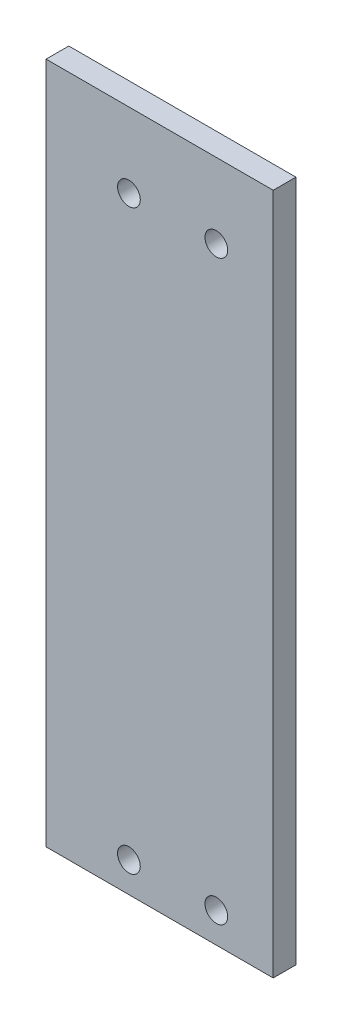
ISO-10303-21;
HEADER;
FILE_DESCRIPTION(('STEP AP214'),'2;1');
FILE_NAME('part.step','',(''),(''),'','','');
FILE_SCHEMA(('AUTOMOTIVE_DESIGN { 1 0 10303 214 1 1 1 1 }'));
ENDSEC;
DATA;
#1=APPLICATION_CONTEXT('core data for automotive mechanical design processes');
#2=APPLICATION_PROTOCOL_DEFINITION('international standard','automotive_design',2000,#1);
#3=PRODUCT_CONTEXT('',#1,'mechanical');
#4=PRODUCT('Part','Part','',(#3));
#5=PRODUCT_RELATED_PRODUCT_CATEGORY('part','',(#4));
#6=PRODUCT_DEFINITION_FORMATION('','',#4);
#7=PRODUCT_DEFINITION_CONTEXT('part definition',#1,'design');
#8=PRODUCT_DEFINITION('design','',#6,#7);
#9=PRODUCT_DEFINITION_SHAPE('','',#8);
#10=(LENGTH_UNIT() NAMED_UNIT(*) SI_UNIT(.MILLI.,.METRE.));
#11=(NAMED_UNIT(*) PLANE_ANGLE_UNIT() SI_UNIT($,.RADIAN.));
#12=(NAMED_UNIT(*) SI_UNIT($,.STERADIAN.) SOLID_ANGLE_UNIT());
#13=UNCERTAINTY_MEASURE_WITH_UNIT(LENGTH_MEASURE(1.E-05),#10,'distance_accuracy_value','');
#14=(GEOMETRIC_REPRESENTATION_CONTEXT(3) GLOBAL_UNCERTAINTY_ASSIGNED_CONTEXT((#13)) GLOBAL_UNIT_ASSIGNED_CONTEXT((#10,
#11,#12)) REPRESENTATION_CONTEXT('',''));
#15=CARTESIAN_POINT('',(0.,0.,0.));
#16=DIRECTION('',(0.,0.,1.));
#17=DIRECTION('',(1.,0.,0.));
#18=AXIS2_PLACEMENT_3D('',#15,#16,#17);
#19=CARTESIAN_POINT('',(0.,0.,5.));
#20=DIRECTION('',(0.,0.,-1.));
#21=DIRECTION('',(-1.,0.,0.));
#22=AXIS2_PLACEMENT_3D('',#19,#20,#21);
#23=PLANE('',#22);
#24=DIRECTION('',(-1.,0.,0.));
#25=VECTOR('',#24,1.);
#26=CARTESIAN_POINT('',(-14.267057546844,150.188218987102,5.));
#27=LINE('',#26,#25);
#28=CARTESIAN_POINT('',(35.7329424531562,150.188218987102,5.));
#29=VERTEX_POINT('',#28);
#30=CARTESIAN_POINT('',(-14.267057546844,150.188218987102,5.));
#31=VERTEX_POINT('',#30);
#32=EDGE_CURVE('E91',#29,#31,#27,.T.);
#33=ORIENTED_EDGE('',*,*,#32,.T.);
#34=DIRECTION('',(0.,-1.,0.));
#35=VECTOR('',#34,1.);
#36=CARTESIAN_POINT('',(-14.267057546844,150.188218987102,5.));
#37=LINE('',#36,#35);
#38=CARTESIAN_POINT('',(-14.267057546844,1.66533453693773E-13,5.));
#39=VERTEX_POINT('',#38);
#40=EDGE_CURVE('E86',#31,#39,#37,.T.);
#41=ORIENTED_EDGE('',*,*,#40,.T.);
#42=DIRECTION('',(1.,0.,0.));
#43=VECTOR('',#42,1.);
#44=CARTESIAN_POINT('',(-14.267057546844,1.66533453693773E-13,5.));
#45=LINE('',#44,#43);
#46=CARTESIAN_POINT('',(35.7329424531562,1.66533453693773E-13,5.));
#47=VERTEX_POINT('',#46);
#48=EDGE_CURVE('E89',#39,#47,#45,.T.);
#49=ORIENTED_EDGE('',*,*,#48,.T.);
#50=DIRECTION('',(0.,1.,0.));
#51=VECTOR('',#50,1.);
#52=CARTESIAN_POINT('',(35.7329424531562,150.188218987102,5.));
#53=LINE('',#52,#51);
#54=EDGE_CURVE('E56',#47,#29,#53,.T.);
#55=ORIENTED_EDGE('',*,*,#54,.T.);
#56=EDGE_LOOP('',(#33,#41,#49,#55));
#57=FACE_BOUND('',#56,.T.);
#58=CARTESIAN_POINT('',(23.2110009360298,6.64734363436636,5.));
#59=DIRECTION('',(0.,0.,1.));
#60=DIRECTION('',(1.,0.,0.));
#61=AXIS2_PLACEMENT_3D('',#58,#59,#60);
#62=CIRCLE('',#61,2.49999999999999);
#63=CARTESIAN_POINT('',(25.7110009360298,6.64734363436636,5.));
#64=VERTEX_POINT('',#63);
#65=EDGE_CURVE('E106',#64,#64,#62,.T.);
#66=ORIENTED_EDGE('',*,*,#65,.F.);
#67=EDGE_LOOP('',(#66));
#68=FACE_BOUND('',#67,.T.);
#69=CARTESIAN_POINT('',(3.96840034913737,6.64734363436636,5.));
#70=DIRECTION('',(0.,0.,1.));
#71=DIRECTION('',(1.,0.,0.));
#72=AXIS2_PLACEMENT_3D('',#69,#70,#71);
#73=CIRCLE('',#72,2.5);
#74=CARTESIAN_POINT('',(6.46840034913737,6.64734363436636,5.));
#75=VERTEX_POINT('',#74);
#76=EDGE_CURVE('E121',#75,#75,#73,.T.);
#77=ORIENTED_EDGE('',*,*,#76,.F.);
#78=EDGE_LOOP('',(#77));
#79=FACE_BOUND('',#78,.T.);
#80=CARTESIAN_POINT('',(3.96840034913735,133.729094339838,5.));
#81=DIRECTION('',(0.,0.,1.));
#82=DIRECTION('',(-1.,0.,0.));
#83=AXIS2_PLACEMENT_3D('',#80,#81,#82);
#84=CIRCLE('',#83,2.5);
#85=CARTESIAN_POINT('',(1.46840034913735,133.729094339838,5.));
#86=VERTEX_POINT('',#85);
#87=EDGE_CURVE('E127',#86,#86,#84,.T.);
#88=ORIENTED_EDGE('',*,*,#87,.F.);
#89=EDGE_LOOP('',(#88));
#90=FACE_BOUND('',#89,.T.);
#91=CARTESIAN_POINT('',(23.2110009360298,133.729094339838,5.));
#92=DIRECTION('',(0.,0.,1.));
#93=DIRECTION('',(-1.,0.,0.));
#94=AXIS2_PLACEMENT_3D('',#91,#92,#93);
#95=CIRCLE('',#94,2.5);
#96=CARTESIAN_POINT('',(20.7110009360298,133.729094339838,5.));
#97=VERTEX_POINT('',#96);
#98=EDGE_CURVE('E133',#97,#97,#95,.T.);
#99=ORIENTED_EDGE('',*,*,#98,.F.);
#100=EDGE_LOOP('',(#99));
#101=FACE_BOUND('',#100,.T.);
#102=ADVANCED_FACE('F39',(#57,#68,#79,#90,#101),#23,.F.);
#103=CARTESIAN_POINT('',(0.,0.,0.));
#104=DIRECTION('',(0.,0.,-1.));
#105=DIRECTION('',(-1.,0.,0.));
#106=AXIS2_PLACEMENT_3D('',#103,#104,#105);
#107=PLANE('',#106);
#108=CARTESIAN_POINT('',(3.96840034913735,133.729094339838,0.));
#109=DIRECTION('',(0.,0.,1.));
#110=DIRECTION('',(-1.,0.,0.));
#111=AXIS2_PLACEMENT_3D('',#108,#109,#110);
#112=CIRCLE('',#111,2.5);
#113=CARTESIAN_POINT('',(1.46840034913735,133.729094339838,0.));
#114=VERTEX_POINT('',#113);
#115=EDGE_CURVE('E130',#114,#114,#112,.T.);
#116=ORIENTED_EDGE('',*,*,#115,.T.);
#117=EDGE_LOOP('',(#116));
#118=FACE_BOUND('',#117,.T.);
#119=CARTESIAN_POINT('',(23.2110009360298,6.64734363436636,0.));
#120=DIRECTION('',(0.,0.,1.));
#121=DIRECTION('',(1.,0.,0.));
#122=AXIS2_PLACEMENT_3D('',#119,#120,#121);
#123=CIRCLE('',#122,2.49999999999999);
#124=CARTESIAN_POINT('',(25.7110009360298,6.64734363436636,0.));
#125=VERTEX_POINT('',#124);
#126=EDGE_CURVE('E118',#125,#125,#123,.T.);
#127=ORIENTED_EDGE('',*,*,#126,.T.);
#128=EDGE_LOOP('',(#127));
#129=FACE_BOUND('',#128,.T.);
#130=DIRECTION('',(-1.,0.,0.));
#131=VECTOR('',#130,1.);
#132=CARTESIAN_POINT('',(-14.267057546844,150.188218987102,0.));
#133=LINE('',#132,#131);
#134=CARTESIAN_POINT('',(35.7329424531562,150.188218987102,0.));
#135=VERTEX_POINT('',#134);
#136=CARTESIAN_POINT('',(-14.267057546844,150.188218987102,0.));
#137=VERTEX_POINT('',#136);
#138=EDGE_CURVE('E103',#135,#137,#133,.T.);
#139=ORIENTED_EDGE('',*,*,#138,.F.);
#140=DIRECTION('',(0.,1.,0.));
#141=VECTOR('',#140,1.);
#142=CARTESIAN_POINT('',(35.7329424531562,150.188218987102,0.));
#143=LINE('',#142,#141);
#144=CARTESIAN_POINT('',(35.7329424531562,1.66533453693773E-13,0.));
#145=VERTEX_POINT('',#144);
#146=EDGE_CURVE('E79',#145,#135,#143,.T.);
#147=ORIENTED_EDGE('',*,*,#146,.F.);
#148=DIRECTION('',(1.,0.,0.));
#149=VECTOR('',#148,1.);
#150=CARTESIAN_POINT('',(-14.267057546844,1.66533453693773E-13,0.));
#151=LINE('',#150,#149);
#152=CARTESIAN_POINT('',(-14.267057546844,1.66533453693773E-13,0.));
#153=VERTEX_POINT('',#152);
#154=EDGE_CURVE('E73',#153,#145,#151,.T.);
#155=ORIENTED_EDGE('',*,*,#154,.F.);
#156=DIRECTION('',(0.,-1.,0.));
#157=VECTOR('',#156,1.);
#158=CARTESIAN_POINT('',(-14.267057546844,150.188218987102,0.));
#159=LINE('',#158,#157);
#160=EDGE_CURVE('E95',#137,#153,#159,.T.);
#161=ORIENTED_EDGE('',*,*,#160,.F.);
#162=EDGE_LOOP('',(#139,#147,#155,#161));
#163=FACE_BOUND('',#162,.T.);
#164=CARTESIAN_POINT('',(3.96840034913737,6.64734363436636,0.));
#165=DIRECTION('',(0.,0.,1.));
#166=DIRECTION('',(1.,0.,0.));
#167=AXIS2_PLACEMENT_3D('',#164,#165,#166);
#168=CIRCLE('',#167,2.5);
#169=CARTESIAN_POINT('',(6.46840034913737,6.64734363436636,0.));
#170=VERTEX_POINT('',#169);
#171=EDGE_CURVE('E124',#170,#170,#168,.T.);
#172=ORIENTED_EDGE('',*,*,#171,.T.);
#173=EDGE_LOOP('',(#172));
#174=FACE_BOUND('',#173,.T.);
#175=CARTESIAN_POINT('',(23.2110009360298,133.729094339838,0.));
#176=DIRECTION('',(0.,0.,1.));
#177=DIRECTION('',(-1.,0.,0.));
#178=AXIS2_PLACEMENT_3D('',#175,#176,#177);
#179=CIRCLE('',#178,2.5);
#180=CARTESIAN_POINT('',(20.7110009360298,133.729094339838,0.));
#181=VERTEX_POINT('',#180);
#182=EDGE_CURVE('E136',#181,#181,#179,.T.);
#183=ORIENTED_EDGE('',*,*,#182,.T.);
#184=EDGE_LOOP('',(#183));
#185=FACE_BOUND('',#184,.T.);
#186=ADVANCED_FACE('F114',(#118,#129,#163,#174,#185),#107,.T.);
#187=CARTESIAN_POINT('',(-14.267057546844,150.188218987102,5.));
#188=DIRECTION('',(0.,-1.,0.));
#189=DIRECTION('',(1.,0.,0.));
#190=AXIS2_PLACEMENT_3D('',#187,#188,#189);
#191=PLANE('',#190);
#192=ORIENTED_EDGE('',*,*,#138,.T.);
#193=DIRECTION('',(0.,0.,-1.));
#194=VECTOR('',#193,1.);
#195=CARTESIAN_POINT('',(-14.267057546844,150.188218987102,5.));
#196=LINE('',#195,#194);
#197=EDGE_CURVE('E11',#31,#137,#196,.T.);
#198=ORIENTED_EDGE('',*,*,#197,.F.);
#199=ORIENTED_EDGE('',*,*,#32,.F.);
#200=DIRECTION('',(0.,0.,-1.));
#201=VECTOR('',#200,1.);
#202=CARTESIAN_POINT('',(35.7329424531562,150.188218987102,5.));
#203=LINE('',#202,#201);
#204=EDGE_CURVE('E99',#29,#135,#203,.T.);
#205=ORIENTED_EDGE('',*,*,#204,.T.);
#206=EDGE_LOOP('',(#192,#198,#199,#205));
#207=FACE_BOUND('',#206,.T.);
#208=ADVANCED_FACE('F41',(#207),#191,.F.);
#209=CARTESIAN_POINT('',(-14.267057546844,150.188218987102,5.));
#210=DIRECTION('',(1.,0.,0.));
#211=DIRECTION('',(0.,0.,-1.));
#212=AXIS2_PLACEMENT_3D('',#209,#210,#211);
#213=PLANE('',#212);
#214=ORIENTED_EDGE('',*,*,#160,.T.);
#215=DIRECTION('',(0.,0.,-1.));
#216=VECTOR('',#215,1.);
#217=CARTESIAN_POINT('',(-14.267057546844,1.66533453693773E-13,5.));
#218=LINE('',#217,#216);
#219=EDGE_CURVE('E48',#39,#153,#218,.T.);
#220=ORIENTED_EDGE('',*,*,#219,.F.);
#221=ORIENTED_EDGE('',*,*,#40,.F.);
#222=ORIENTED_EDGE('',*,*,#197,.T.);
#223=EDGE_LOOP('',(#214,#220,#221,#222));
#224=FACE_BOUND('',#223,.T.);
#225=ADVANCED_FACE('F94',(#224),#213,.F.);
#226=CARTESIAN_POINT('',(-14.267057546844,1.66533453693773E-13,5.));
#227=DIRECTION('',(0.,1.,0.));
#228=DIRECTION('',(0.,0.,1.));
#229=AXIS2_PLACEMENT_3D('',#226,#227,#228);
#230=PLANE('',#229);
#231=ORIENTED_EDGE('',*,*,#154,.T.);
#232=DIRECTION('',(0.,0.,-1.));
#233=VECTOR('',#232,1.);
#234=CARTESIAN_POINT('',(35.7329424531562,1.66533453693773E-13,5.));
#235=LINE('',#234,#233);
#236=EDGE_CURVE('E96',#47,#145,#235,.T.);
#237=ORIENTED_EDGE('',*,*,#236,.F.);
#238=ORIENTED_EDGE('',*,*,#48,.F.);
#239=ORIENTED_EDGE('',*,*,#219,.T.);
#240=EDGE_LOOP('',(#231,#237,#238,#239));
#241=FACE_BOUND('',#240,.T.);
#242=ADVANCED_FACE('F97',(#241),#230,.F.);
#243=CARTESIAN_POINT('',(35.7329424531562,150.188218987102,5.));
#244=DIRECTION('',(-1.,0.,0.));
#245=DIRECTION('',(0.,0.,1.));
#246=AXIS2_PLACEMENT_3D('',#243,#244,#245);
#247=PLANE('',#246);
#248=ORIENTED_EDGE('',*,*,#146,.T.);
#249=ORIENTED_EDGE('',*,*,#204,.F.);
#250=ORIENTED_EDGE('',*,*,#54,.F.);
#251=ORIENTED_EDGE('',*,*,#236,.T.);
#252=EDGE_LOOP('',(#248,#249,#250,#251));
#253=FACE_BOUND('',#252,.T.);
#254=ADVANCED_FACE('F111',(#253),#247,.F.);
#255=CARTESIAN_POINT('',(23.2110009360298,6.64734363436636,5.));
#256=DIRECTION('',(0.,0.,-1.));
#257=DIRECTION('',(-1.,0.,0.));
#258=AXIS2_PLACEMENT_3D('',#255,#256,#257);
#259=CYLINDRICAL_SURFACE('',#258,2.49999999999999);
#260=ORIENTED_EDGE('',*,*,#65,.T.);
#261=EDGE_LOOP('',(#260));
#262=FACE_BOUND('',#261,.T.);
#263=ORIENTED_EDGE('',*,*,#126,.F.);
#264=EDGE_LOOP('',(#263));
#265=FACE_BOUND('',#264,.T.);
#266=ADVANCED_FACE('F153',(#262,#265),#259,.F.);
#267=CARTESIAN_POINT('',(3.96840034913737,6.64734363436636,5.));
#268=DIRECTION('',(0.,0.,-1.));
#269=DIRECTION('',(-1.,0.,0.));
#270=AXIS2_PLACEMENT_3D('',#267,#268,#269);
#271=CYLINDRICAL_SURFACE('',#270,2.5);
#272=ORIENTED_EDGE('',*,*,#76,.T.);
#273=EDGE_LOOP('',(#272));
#274=FACE_BOUND('',#273,.T.);
#275=ORIENTED_EDGE('',*,*,#171,.F.);
#276=EDGE_LOOP('',(#275));
#277=FACE_BOUND('',#276,.T.);
#278=ADVANCED_FACE('F198',(#274,#277),#271,.F.);
#279=CARTESIAN_POINT('',(3.96840034913735,133.729094339838,5.));
#280=DIRECTION('',(0.,0.,-1.));
#281=DIRECTION('',(-1.,0.,0.));
#282=AXIS2_PLACEMENT_3D('',#279,#280,#281);
#283=CYLINDRICAL_SURFACE('',#282,2.5);
#284=ORIENTED_EDGE('',*,*,#87,.T.);
#285=EDGE_LOOP('',(#284));
#286=FACE_BOUND('',#285,.T.);
#287=ORIENTED_EDGE('',*,*,#115,.F.);
#288=EDGE_LOOP('',(#287));
#289=FACE_BOUND('',#288,.T.);
#290=ADVANCED_FACE('F206',(#286,#289),#283,.F.);
#291=CARTESIAN_POINT('',(23.2110009360298,133.729094339838,5.));
#292=DIRECTION('',(0.,0.,-1.));
#293=DIRECTION('',(-1.,0.,0.));
#294=AXIS2_PLACEMENT_3D('',#291,#292,#293);
#295=CYLINDRICAL_SURFACE('',#294,2.5);
#296=ORIENTED_EDGE('',*,*,#98,.T.);
#297=EDGE_LOOP('',(#296));
#298=FACE_BOUND('',#297,.T.);
#299=ORIENTED_EDGE('',*,*,#182,.F.);
#300=EDGE_LOOP('',(#299));
#301=FACE_BOUND('',#300,.T.);
#302=ADVANCED_FACE('F142',(#298,#301),#295,.F.);
#303=CLOSED_SHELL('',(#102,#186,#208,#225,#242,#254,#266,#278,#290,#302));
#304=MANIFOLD_SOLID_BREP('B2',#303);
#305=ADVANCED_BREP_SHAPE_REPRESENTATION('',(#18,#304),#14);
#306=SHAPE_DEFINITION_REPRESENTATION(#9,#305);
ENDSEC;
END-ISO-10303-21;
